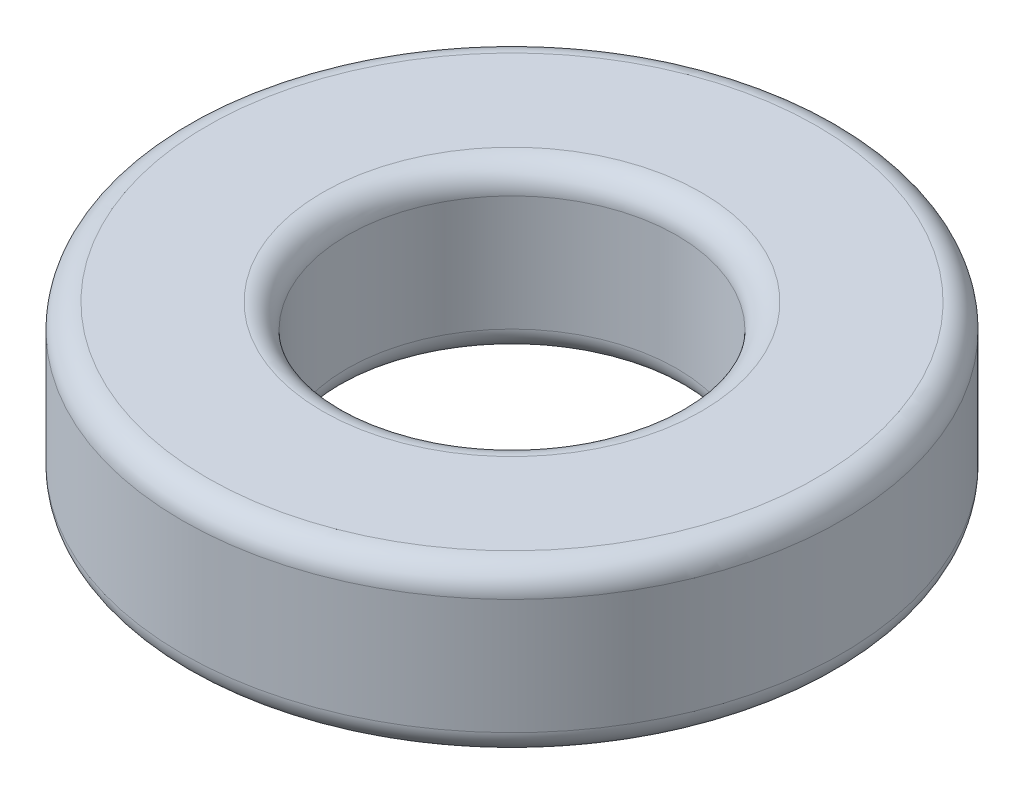
ISO-10303-21;
HEADER;
FILE_DESCRIPTION(('STEP AP214'),'2;1');
FILE_NAME('part.step','',(''),(''),'','','');
FILE_SCHEMA(('AUTOMOTIVE_DESIGN { 1 0 10303 214 1 1 1 1 }'));
ENDSEC;
DATA;
#1=APPLICATION_CONTEXT('core data for automotive mechanical design processes');
#2=APPLICATION_PROTOCOL_DEFINITION('international standard','automotive_design',2000,#1);
#3=PRODUCT_CONTEXT('',#1,'mechanical');
#4=PRODUCT('Part','Part','',(#3));
#5=PRODUCT_RELATED_PRODUCT_CATEGORY('part','',(#4));
#6=PRODUCT_DEFINITION_FORMATION('','',#4);
#7=PRODUCT_DEFINITION_CONTEXT('part definition',#1,'design');
#8=PRODUCT_DEFINITION('design','',#6,#7);
#9=PRODUCT_DEFINITION_SHAPE('','',#8);
#10=(LENGTH_UNIT() NAMED_UNIT(*) SI_UNIT(.MILLI.,.METRE.));
#11=(NAMED_UNIT(*) PLANE_ANGLE_UNIT() SI_UNIT($,.RADIAN.));
#12=(NAMED_UNIT(*) SI_UNIT($,.STERADIAN.) SOLID_ANGLE_UNIT());
#13=UNCERTAINTY_MEASURE_WITH_UNIT(LENGTH_MEASURE(1.E-05),#10,'distance_accuracy_value','');
#14=(GEOMETRIC_REPRESENTATION_CONTEXT(3) GLOBAL_UNCERTAINTY_ASSIGNED_CONTEXT((#13)) GLOBAL_UNIT_ASSIGNED_CONTEXT((#10,
#11,#12)) REPRESENTATION_CONTEXT('',''));
#15=CARTESIAN_POINT('',(0.,0.,0.));
#16=DIRECTION('',(0.,0.,1.));
#17=DIRECTION('',(1.,0.,0.));
#18=AXIS2_PLACEMENT_3D('',#15,#16,#17);
#19=CARTESIAN_POINT('',(0.,12.7,0.));
#20=DIRECTION('',(0.,-1.,0.));
#21=DIRECTION('',(0.,0.,-1.));
#22=AXIS2_PLACEMENT_3D('',#19,#20,#21);
#23=CYLINDRICAL_SURFACE('',#22,50.8);
#24=CARTESIAN_POINT('',(0.,8.89,0.));
#25=DIRECTION('',(0.,1.,0.));
#26=DIRECTION('',(0.,0.,1.));
#27=AXIS2_PLACEMENT_3D('',#24,#25,#26);
#28=CIRCLE('',#27,50.8);
#29=CARTESIAN_POINT('',(0.,8.89,50.8));
#30=VERTEX_POINT('',#29);
#31=EDGE_CURVE('E50',#30,#30,#28,.F.);
#32=ORIENTED_EDGE('',*,*,#31,.T.);
#33=EDGE_LOOP('',(#32));
#34=FACE_BOUND('',#33,.T.);
#35=CARTESIAN_POINT('',(0.,-8.89,0.));
#36=DIRECTION('',(0.,1.,0.));
#37=DIRECTION('',(0.,0.,1.));
#38=AXIS2_PLACEMENT_3D('',#35,#36,#37);
#39=CIRCLE('',#38,50.8);
#40=CARTESIAN_POINT('',(0.,-8.89,50.8));
#41=VERTEX_POINT('',#40);
#42=EDGE_CURVE('E73',#41,#41,#39,.T.);
#43=ORIENTED_EDGE('',*,*,#42,.T.);
#44=EDGE_LOOP('',(#43));
#45=FACE_BOUND('',#44,.T.);
#46=ADVANCED_FACE('F37',(#34,#45),#23,.T.);
#47=CARTESIAN_POINT('',(0.,12.7,0.));
#48=DIRECTION('',(0.,1.,0.));
#49=DIRECTION('',(0.,0.,1.));
#50=AXIS2_PLACEMENT_3D('',#47,#48,#49);
#51=PLANE('',#50);
#52=CARTESIAN_POINT('',(0.,12.7,0.));
#53=DIRECTION('',(0.,1.,0.));
#54=DIRECTION('',(0.,0.,1.));
#55=AXIS2_PLACEMENT_3D('',#52,#53,#54);
#56=CIRCLE('',#55,29.21);
#57=CARTESIAN_POINT('',(0.,12.7,29.21));
#58=VERTEX_POINT('',#57);
#59=EDGE_CURVE('E10',#58,#58,#56,.F.);
#60=ORIENTED_EDGE('',*,*,#59,.T.);
#61=EDGE_LOOP('',(#60));
#62=FACE_BOUND('',#61,.T.);
#63=CARTESIAN_POINT('',(0.,12.7,0.));
#64=DIRECTION('',(0.,1.,0.));
#65=DIRECTION('',(0.,0.,1.));
#66=AXIS2_PLACEMENT_3D('',#63,#64,#65);
#67=CIRCLE('',#66,46.99);
#68=CARTESIAN_POINT('',(0.,12.7,46.99));
#69=VERTEX_POINT('',#68);
#70=EDGE_CURVE('E55',#69,#69,#67,.T.);
#71=ORIENTED_EDGE('',*,*,#70,.T.);
#72=EDGE_LOOP('',(#71));
#73=FACE_BOUND('',#72,.T.);
#74=ADVANCED_FACE('F97',(#62,#73),#51,.T.);
#75=CARTESIAN_POINT('',(0.,-12.7,0.));
#76=DIRECTION('',(0.,1.,0.));
#77=DIRECTION('',(0.,0.,1.));
#78=AXIS2_PLACEMENT_3D('',#75,#76,#77);
#79=PLANE('',#78);
#80=CARTESIAN_POINT('',(0.,-12.7,0.));
#81=DIRECTION('',(0.,1.,0.));
#82=DIRECTION('',(0.,0.,1.));
#83=AXIS2_PLACEMENT_3D('',#80,#81,#82);
#84=CIRCLE('',#83,29.21);
#85=CARTESIAN_POINT('',(0.,-12.7,29.21));
#86=VERTEX_POINT('',#85);
#87=EDGE_CURVE('E65',#86,#86,#84,.T.);
#88=ORIENTED_EDGE('',*,*,#87,.T.);
#89=EDGE_LOOP('',(#88));
#90=FACE_BOUND('',#89,.T.);
#91=CARTESIAN_POINT('',(0.,-12.7,0.));
#92=DIRECTION('',(0.,1.,0.));
#93=DIRECTION('',(0.,0.,1.));
#94=AXIS2_PLACEMENT_3D('',#91,#92,#93);
#95=CIRCLE('',#94,46.99);
#96=CARTESIAN_POINT('',(0.,-12.7,46.99));
#97=VERTEX_POINT('',#96);
#98=EDGE_CURVE('E69',#97,#97,#95,.F.);
#99=ORIENTED_EDGE('',*,*,#98,.T.);
#100=EDGE_LOOP('',(#99));
#101=FACE_BOUND('',#100,.T.);
#102=ADVANCED_FACE('F92',(#90,#101),#79,.F.);
#103=CARTESIAN_POINT('',(0.,-13.97,0.));
#104=DIRECTION('',(0.,1.,0.));
#105=DIRECTION('',(0.,0.,1.));
#106=AXIS2_PLACEMENT_3D('',#103,#104,#105);
#107=CYLINDRICAL_SURFACE('',#106,25.4);
#108=CARTESIAN_POINT('',(0.,8.89,0.));
#109=DIRECTION('',(0.,1.,0.));
#110=DIRECTION('',(0.,0.,1.));
#111=AXIS2_PLACEMENT_3D('',#108,#109,#110);
#112=CIRCLE('',#111,25.4);
#113=CARTESIAN_POINT('',(0.,8.89,25.4));
#114=VERTEX_POINT('',#113);
#115=EDGE_CURVE('E45',#114,#114,#112,.T.);
#116=ORIENTED_EDGE('',*,*,#115,.T.);
#117=EDGE_LOOP('',(#116));
#118=FACE_BOUND('',#117,.T.);
#119=CARTESIAN_POINT('',(0.,-8.89,0.));
#120=DIRECTION('',(0.,1.,0.));
#121=DIRECTION('',(0.,0.,1.));
#122=AXIS2_PLACEMENT_3D('',#119,#120,#121);
#123=CIRCLE('',#122,25.4);
#124=CARTESIAN_POINT('',(0.,-8.89,25.4));
#125=VERTEX_POINT('',#124);
#126=EDGE_CURVE('E61',#125,#125,#123,.F.);
#127=ORIENTED_EDGE('',*,*,#126,.T.);
#128=EDGE_LOOP('',(#127));
#129=FACE_BOUND('',#128,.T.);
#130=ADVANCED_FACE('F82',(#118,#129),#107,.F.);
#131=CARTESIAN_POINT('',(0.,-8.89,0.));
#132=DIRECTION('',(0.,1.,0.));
#133=DIRECTION('',(0.,0.,1.));
#134=AXIS2_PLACEMENT_3D('',#131,#132,#133);
#135=TOROIDAL_SURFACE('',#134,46.99,3.81);
#136=ORIENTED_EDGE('',*,*,#98,.F.);
#137=EDGE_LOOP('',(#136));
#138=FACE_BOUND('',#137,.T.);
#139=ORIENTED_EDGE('',*,*,#42,.F.);
#140=EDGE_LOOP('',(#139));
#141=FACE_BOUND('',#140,.T.);
#142=ADVANCED_FACE('F79',(#138,#141),#135,.T.);
#143=CARTESIAN_POINT('',(0.,-8.89,0.));
#144=DIRECTION('',(0.,1.,0.));
#145=DIRECTION('',(0.,0.,1.));
#146=AXIS2_PLACEMENT_3D('',#143,#144,#145);
#147=TOROIDAL_SURFACE('',#146,29.21,3.81);
#148=ORIENTED_EDGE('',*,*,#126,.F.);
#149=EDGE_LOOP('',(#148));
#150=FACE_BOUND('',#149,.T.);
#151=ORIENTED_EDGE('',*,*,#87,.F.);
#152=EDGE_LOOP('',(#151));
#153=FACE_BOUND('',#152,.T.);
#154=ADVANCED_FACE('F81',(#150,#153),#147,.T.);
#155=CARTESIAN_POINT('',(0.,8.89,0.));
#156=DIRECTION('',(0.,1.,0.));
#157=DIRECTION('',(0.,0.,1.));
#158=AXIS2_PLACEMENT_3D('',#155,#156,#157);
#159=TOROIDAL_SURFACE('',#158,46.99,3.81);
#160=ORIENTED_EDGE('',*,*,#31,.F.);
#161=EDGE_LOOP('',(#160));
#162=FACE_BOUND('',#161,.T.);
#163=ORIENTED_EDGE('',*,*,#70,.F.);
#164=EDGE_LOOP('',(#163));
#165=FACE_BOUND('',#164,.T.);
#166=ADVANCED_FACE('F89',(#162,#165),#159,.T.);
#167=CARTESIAN_POINT('',(0.,8.89,0.));
#168=DIRECTION('',(0.,1.,0.));
#169=DIRECTION('',(0.,0.,1.));
#170=AXIS2_PLACEMENT_3D('',#167,#168,#169);
#171=TOROIDAL_SURFACE('',#170,29.21,3.81);
#172=ORIENTED_EDGE('',*,*,#59,.F.);
#173=EDGE_LOOP('',(#172));
#174=FACE_BOUND('',#173,.T.);
#175=ORIENTED_EDGE('',*,*,#115,.F.);
#176=EDGE_LOOP('',(#175));
#177=FACE_BOUND('',#176,.T.);
#178=ADVANCED_FACE('F39',(#174,#177),#171,.T.);
#179=CLOSED_SHELL('',(#46,#74,#102,#130,#142,#154,#166,#178));
#180=MANIFOLD_SOLID_BREP('B2',#179);
#181=ADVANCED_BREP_SHAPE_REPRESENTATION('',(#18,#180),#14);
#182=SHAPE_DEFINITION_REPRESENTATION(#9,#181);
ENDSEC;
END-ISO-10303-21;
